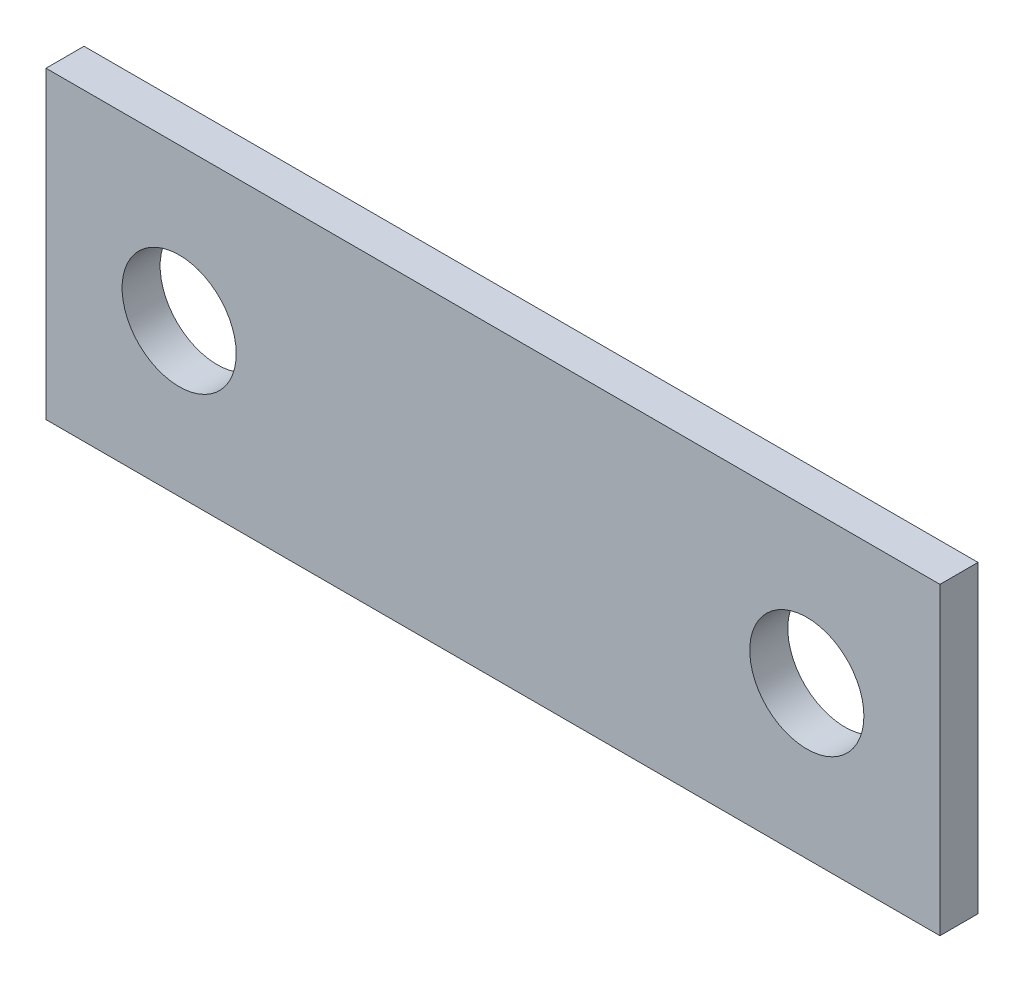
ISO-10303-21;
HEADER;
FILE_DESCRIPTION(('STEP AP214'),'2;1');
FILE_NAME('part.step','',(''),(''),'','','');
FILE_SCHEMA(('AUTOMOTIVE_DESIGN { 1 0 10303 214 1 1 1 1 }'));
ENDSEC;
DATA;
#1=APPLICATION_CONTEXT('core data for automotive mechanical design processes');
#2=APPLICATION_PROTOCOL_DEFINITION('international standard','automotive_design',2000,#1);
#3=PRODUCT_CONTEXT('',#1,'mechanical');
#4=PRODUCT('Part','Part','',(#3));
#5=PRODUCT_RELATED_PRODUCT_CATEGORY('part','',(#4));
#6=PRODUCT_DEFINITION_FORMATION('','',#4);
#7=PRODUCT_DEFINITION_CONTEXT('part definition',#1,'design');
#8=PRODUCT_DEFINITION('design','',#6,#7);
#9=PRODUCT_DEFINITION_SHAPE('','',#8);
#10=(LENGTH_UNIT() NAMED_UNIT(*) SI_UNIT(.MILLI.,.METRE.));
#11=(NAMED_UNIT(*) PLANE_ANGLE_UNIT() SI_UNIT($,.RADIAN.));
#12=(NAMED_UNIT(*) SI_UNIT($,.STERADIAN.) SOLID_ANGLE_UNIT());
#13=UNCERTAINTY_MEASURE_WITH_UNIT(LENGTH_MEASURE(1.E-05),#10,'distance_accuracy_value','');
#14=(GEOMETRIC_REPRESENTATION_CONTEXT(3) GLOBAL_UNCERTAINTY_ASSIGNED_CONTEXT((#13)) GLOBAL_UNIT_ASSIGNED_CONTEXT((#10,
#11,#12)) REPRESENTATION_CONTEXT('',''));
#15=CARTESIAN_POINT('',(0.,0.,0.));
#16=DIRECTION('',(0.,0.,1.));
#17=DIRECTION('',(1.,0.,0.));
#18=AXIS2_PLACEMENT_3D('',#15,#16,#17);
#19=CARTESIAN_POINT('',(-37.30625,12.7,3.175));
#20=DIRECTION('',(0.,0.,1.));
#21=DIRECTION('',(1.,0.,0.));
#22=AXIS2_PLACEMENT_3D('',#19,#20,#21);
#23=PLANE('',#22);
#24=CARTESIAN_POINT('',(-26.19375,0.,3.175));
#25=DIRECTION('',(0.,0.,1.));
#26=DIRECTION('',(1.,0.,0.));
#27=AXIS2_PLACEMENT_3D('',#24,#25,#26);
#28=CIRCLE('',#27,4.7625);
#29=CARTESIAN_POINT('',(-21.43125,0.,3.175));
#30=VERTEX_POINT('',#29);
#31=EDGE_CURVE('E114',#30,#30,#28,.T.);
#32=ORIENTED_EDGE('',*,*,#31,.F.);
#33=EDGE_LOOP('',(#32));
#34=FACE_BOUND('',#33,.T.);
#35=DIRECTION('',(0.,-1.,0.));
#36=VECTOR('',#35,1.);
#37=CARTESIAN_POINT('',(-37.30625,-12.7,3.175));
#38=LINE('',#37,#36);
#39=CARTESIAN_POINT('',(-37.30625,12.7,3.175));
#40=VERTEX_POINT('',#39);
#41=CARTESIAN_POINT('',(-37.30625,-12.7,3.175));
#42=VERTEX_POINT('',#41);
#43=EDGE_CURVE('E94',#40,#42,#38,.T.);
#44=ORIENTED_EDGE('',*,*,#43,.T.);
#45=DIRECTION('',(1.,0.,0.));
#46=VECTOR('',#45,1.);
#47=CARTESIAN_POINT('',(37.30625,-12.7,3.175));
#48=LINE('',#47,#46);
#49=CARTESIAN_POINT('',(37.30625,-12.7,3.175));
#50=VERTEX_POINT('',#49);
#51=EDGE_CURVE('E89',#42,#50,#48,.T.);
#52=ORIENTED_EDGE('',*,*,#51,.T.);
#53=DIRECTION('',(0.,1.,0.));
#54=VECTOR('',#53,1.);
#55=CARTESIAN_POINT('',(37.30625,-12.7,3.175));
#56=LINE('',#55,#54);
#57=CARTESIAN_POINT('',(37.30625,12.7,3.175));
#58=VERTEX_POINT('',#57);
#59=EDGE_CURVE('E92',#50,#58,#56,.T.);
#60=ORIENTED_EDGE('',*,*,#59,.T.);
#61=DIRECTION('',(-1.,0.,0.));
#62=VECTOR('',#61,1.);
#63=CARTESIAN_POINT('',(37.30625,12.7,3.175));
#64=LINE('',#63,#62);
#65=EDGE_CURVE('E59',#58,#40,#64,.T.);
#66=ORIENTED_EDGE('',*,*,#65,.T.);
#67=EDGE_LOOP('',(#44,#52,#60,#66));
#68=FACE_BOUND('',#67,.T.);
#69=CARTESIAN_POINT('',(26.19375,0.,3.175));
#70=DIRECTION('',(0.,0.,1.));
#71=DIRECTION('',(1.,0.,0.));
#72=AXIS2_PLACEMENT_3D('',#69,#70,#71);
#73=CIRCLE('',#72,4.7625);
#74=CARTESIAN_POINT('',(30.95625,0.,3.175));
#75=VERTEX_POINT('',#74);
#76=EDGE_CURVE('E136',#75,#75,#73,.T.);
#77=ORIENTED_EDGE('',*,*,#76,.F.);
#78=EDGE_LOOP('',(#77));
#79=FACE_BOUND('',#78,.T.);
#80=ADVANCED_FACE('F41',(#34,#68,#79),#23,.T.);
#81=CARTESIAN_POINT('',(-37.30625,12.7,0.));
#82=DIRECTION('',(0.,0.,1.));
#83=DIRECTION('',(1.,0.,0.));
#84=AXIS2_PLACEMENT_3D('',#81,#82,#83);
#85=PLANE('',#84);
#86=CARTESIAN_POINT('',(-26.19375,0.,0.));
#87=DIRECTION('',(0.,0.,1.));
#88=DIRECTION('',(1.,0.,0.));
#89=AXIS2_PLACEMENT_3D('',#86,#87,#88);
#90=CIRCLE('',#89,4.7625);
#91=CARTESIAN_POINT('',(-21.43125,0.,0.));
#92=VERTEX_POINT('',#91);
#93=EDGE_CURVE('E132',#92,#92,#90,.T.);
#94=ORIENTED_EDGE('',*,*,#93,.T.);
#95=EDGE_LOOP('',(#94));
#96=FACE_BOUND('',#95,.T.);
#97=DIRECTION('',(0.,-1.,0.));
#98=VECTOR('',#97,1.);
#99=CARTESIAN_POINT('',(-37.30625,-12.7,0.));
#100=LINE('',#99,#98);
#101=CARTESIAN_POINT('',(-37.30625,12.7,0.));
#102=VERTEX_POINT('',#101);
#103=CARTESIAN_POINT('',(-37.30625,-12.7,0.));
#104=VERTEX_POINT('',#103);
#105=EDGE_CURVE('E110',#102,#104,#100,.T.);
#106=ORIENTED_EDGE('',*,*,#105,.F.);
#107=DIRECTION('',(-1.,0.,0.));
#108=VECTOR('',#107,1.);
#109=CARTESIAN_POINT('',(37.30625,12.7,0.));
#110=LINE('',#109,#108);
#111=CARTESIAN_POINT('',(37.30625,12.7,0.));
#112=VERTEX_POINT('',#111);
#113=EDGE_CURVE('E82',#112,#102,#110,.T.);
#114=ORIENTED_EDGE('',*,*,#113,.F.);
#115=DIRECTION('',(0.,1.,0.));
#116=VECTOR('',#115,1.);
#117=CARTESIAN_POINT('',(37.30625,-12.7,0.));
#118=LINE('',#117,#116);
#119=CARTESIAN_POINT('',(37.30625,-12.7,0.));
#120=VERTEX_POINT('',#119);
#121=EDGE_CURVE('E76',#120,#112,#118,.T.);
#122=ORIENTED_EDGE('',*,*,#121,.F.);
#123=DIRECTION('',(1.,0.,0.));
#124=VECTOR('',#123,1.);
#125=CARTESIAN_POINT('',(37.30625,-12.7,0.));
#126=LINE('',#125,#124);
#127=EDGE_CURVE('E99',#104,#120,#126,.T.);
#128=ORIENTED_EDGE('',*,*,#127,.F.);
#129=EDGE_LOOP('',(#106,#114,#122,#128));
#130=FACE_BOUND('',#129,.T.);
#131=CARTESIAN_POINT('',(26.19375,0.,0.));
#132=DIRECTION('',(0.,0.,1.));
#133=DIRECTION('',(1.,0.,0.));
#134=AXIS2_PLACEMENT_3D('',#131,#132,#133);
#135=CIRCLE('',#134,4.7625);
#136=CARTESIAN_POINT('',(30.95625,0.,0.));
#137=VERTEX_POINT('',#136);
#138=EDGE_CURVE('E140',#137,#137,#135,.T.);
#139=ORIENTED_EDGE('',*,*,#138,.T.);
#140=EDGE_LOOP('',(#139));
#141=FACE_BOUND('',#140,.T.);
#142=ADVANCED_FACE('F127',(#96,#130,#141),#85,.F.);
#143=CARTESIAN_POINT('',(-37.30625,-12.7,3.175));
#144=DIRECTION('',(1.,0.,0.));
#145=DIRECTION('',(0.,0.,-1.));
#146=AXIS2_PLACEMENT_3D('',#143,#144,#145);
#147=PLANE('',#146);
#148=ORIENTED_EDGE('',*,*,#105,.T.);
#149=DIRECTION('',(0.,0.,-1.));
#150=VECTOR('',#149,1.);
#151=CARTESIAN_POINT('',(-37.30625,-12.7,3.175));
#152=LINE('',#151,#150);
#153=EDGE_CURVE('E11',#42,#104,#152,.T.);
#154=ORIENTED_EDGE('',*,*,#153,.F.);
#155=ORIENTED_EDGE('',*,*,#43,.F.);
#156=DIRECTION('',(0.,0.,-1.));
#157=VECTOR('',#156,1.);
#158=CARTESIAN_POINT('',(-37.30625,12.7,3.175));
#159=LINE('',#158,#157);
#160=EDGE_CURVE('E106',#40,#102,#159,.T.);
#161=ORIENTED_EDGE('',*,*,#160,.T.);
#162=EDGE_LOOP('',(#148,#154,#155,#161));
#163=FACE_BOUND('',#162,.T.);
#164=ADVANCED_FACE('F43',(#163),#147,.F.);
#165=CARTESIAN_POINT('',(37.30625,-12.7,3.175));
#166=DIRECTION('',(0.,1.,0.));
#167=DIRECTION('',(-1.,0.,0.));
#168=AXIS2_PLACEMENT_3D('',#165,#166,#167);
#169=PLANE('',#168);
#170=ORIENTED_EDGE('',*,*,#127,.T.);
#171=DIRECTION('',(0.,0.,-1.));
#172=VECTOR('',#171,1.);
#173=CARTESIAN_POINT('',(37.30625,-12.7,3.175));
#174=LINE('',#173,#172);
#175=EDGE_CURVE('E51',#50,#120,#174,.T.);
#176=ORIENTED_EDGE('',*,*,#175,.F.);
#177=ORIENTED_EDGE('',*,*,#51,.F.);
#178=ORIENTED_EDGE('',*,*,#153,.T.);
#179=EDGE_LOOP('',(#170,#176,#177,#178));
#180=FACE_BOUND('',#179,.T.);
#181=ADVANCED_FACE('F98',(#180),#169,.F.);
#182=CARTESIAN_POINT('',(37.30625,-12.7,3.175));
#183=DIRECTION('',(-1.,0.,0.));
#184=DIRECTION('',(0.,0.,1.));
#185=AXIS2_PLACEMENT_3D('',#182,#183,#184);
#186=PLANE('',#185);
#187=ORIENTED_EDGE('',*,*,#121,.T.);
#188=DIRECTION('',(0.,0.,-1.));
#189=VECTOR('',#188,1.);
#190=CARTESIAN_POINT('',(37.30625,12.7,3.175));
#191=LINE('',#190,#189);
#192=EDGE_CURVE('E101',#58,#112,#191,.T.);
#193=ORIENTED_EDGE('',*,*,#192,.F.);
#194=ORIENTED_EDGE('',*,*,#59,.F.);
#195=ORIENTED_EDGE('',*,*,#175,.T.);
#196=EDGE_LOOP('',(#187,#193,#194,#195));
#197=FACE_BOUND('',#196,.T.);
#198=ADVANCED_FACE('F102',(#197),#186,.F.);
#199=CARTESIAN_POINT('',(37.30625,12.7,3.175));
#200=DIRECTION('',(0.,-1.,0.));
#201=DIRECTION('',(1.,0.,0.));
#202=AXIS2_PLACEMENT_3D('',#199,#200,#201);
#203=PLANE('',#202);
#204=ORIENTED_EDGE('',*,*,#113,.T.);
#205=ORIENTED_EDGE('',*,*,#160,.F.);
#206=ORIENTED_EDGE('',*,*,#65,.F.);
#207=ORIENTED_EDGE('',*,*,#192,.T.);
#208=EDGE_LOOP('',(#204,#205,#206,#207));
#209=FACE_BOUND('',#208,.T.);
#210=ADVANCED_FACE('F124',(#209),#203,.F.);
#211=CARTESIAN_POINT('',(-26.19375,0.,3.175));
#212=DIRECTION('',(0.,0.,-1.));
#213=DIRECTION('',(-1.,0.,0.));
#214=AXIS2_PLACEMENT_3D('',#211,#212,#213);
#215=CYLINDRICAL_SURFACE('',#214,4.7625);
#216=ORIENTED_EDGE('',*,*,#31,.T.);
#217=EDGE_LOOP('',(#216));
#218=FACE_BOUND('',#217,.T.);
#219=ORIENTED_EDGE('',*,*,#93,.F.);
#220=EDGE_LOOP('',(#219));
#221=FACE_BOUND('',#220,.T.);
#222=ADVANCED_FACE('F160',(#218,#221),#215,.F.);
#223=CARTESIAN_POINT('',(26.19375,0.,3.175));
#224=DIRECTION('',(0.,0.,-1.));
#225=DIRECTION('',(-1.,0.,0.));
#226=AXIS2_PLACEMENT_3D('',#223,#224,#225);
#227=CYLINDRICAL_SURFACE('',#226,4.7625);
#228=ORIENTED_EDGE('',*,*,#76,.T.);
#229=EDGE_LOOP('',(#228));
#230=FACE_BOUND('',#229,.T.);
#231=ORIENTED_EDGE('',*,*,#138,.F.);
#232=EDGE_LOOP('',(#231));
#233=FACE_BOUND('',#232,.T.);
#234=ADVANCED_FACE('F148',(#230,#233),#227,.F.);
#235=CLOSED_SHELL('',(#80,#142,#164,#181,#198,#210,#222,#234));
#236=MANIFOLD_SOLID_BREP('B2',#235);
#237=ADVANCED_BREP_SHAPE_REPRESENTATION('',(#18,#236),#14);
#238=SHAPE_DEFINITION_REPRESENTATION(#9,#237);
ENDSEC;
END-ISO-10303-21;
